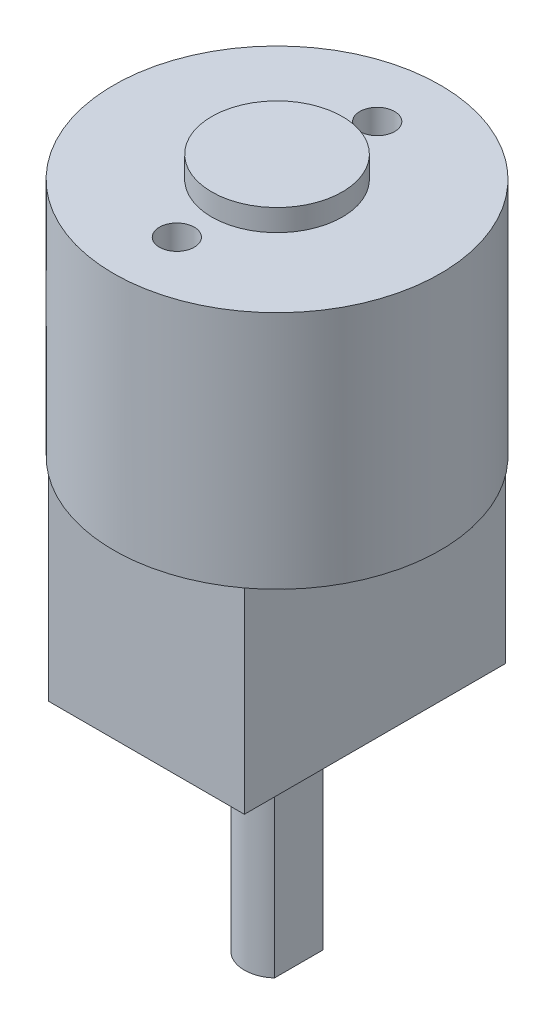
ISO-10303-21;
HEADER;
FILE_DESCRIPTION(('STEP AP214'),'2;1');
FILE_NAME('part.step','',(''),(''),'','','');
FILE_SCHEMA(('AUTOMOTIVE_DESIGN { 1 0 10303 214 1 1 1 1 }'));
ENDSEC;
DATA;
#1=APPLICATION_CONTEXT('core data for automotive mechanical design processes');
#2=APPLICATION_PROTOCOL_DEFINITION('international standard','automotive_design',2000,#1);
#3=PRODUCT_CONTEXT('',#1,'mechanical');
#4=PRODUCT('Part','Part','',(#3));
#5=PRODUCT_RELATED_PRODUCT_CATEGORY('part','',(#4));
#6=PRODUCT_DEFINITION_FORMATION('','',#4);
#7=PRODUCT_DEFINITION_CONTEXT('part definition',#1,'design');
#8=PRODUCT_DEFINITION('design','',#6,#7);
#9=PRODUCT_DEFINITION_SHAPE('','',#8);
#10=(LENGTH_UNIT() NAMED_UNIT(*) SI_UNIT(.MILLI.,.METRE.));
#11=(NAMED_UNIT(*) PLANE_ANGLE_UNIT() SI_UNIT($,.RADIAN.));
#12=(NAMED_UNIT(*) SI_UNIT($,.STERADIAN.) SOLID_ANGLE_UNIT());
#13=UNCERTAINTY_MEASURE_WITH_UNIT(LENGTH_MEASURE(1.E-05),#10,'distance_accuracy_value','');
#14=(GEOMETRIC_REPRESENTATION_CONTEXT(3) GLOBAL_UNCERTAINTY_ASSIGNED_CONTEXT((#13)) GLOBAL_UNIT_ASSIGNED_CONTEXT((#10,
#11,#12)) REPRESENTATION_CONTEXT('',''));
#15=CARTESIAN_POINT('',(0.,0.,0.));
#16=DIRECTION('',(0.,0.,1.));
#17=DIRECTION('',(1.,0.,0.));
#18=AXIS2_PLACEMENT_3D('',#15,#16,#17);
#19=CARTESIAN_POINT('',(0.,0.,0.));
#20=DIRECTION('',(0.,1.,0.));
#21=DIRECTION('',(0.,0.,1.));
#22=AXIS2_PLACEMENT_3D('',#19,#20,#21);
#23=PLANE('',#22);
#24=DIRECTION('',(0.,0.,-1.));
#25=VECTOR('',#24,1.);
#26=CARTESIAN_POINT('',(-4.5,0.,6.));
#27=LINE('',#26,#25);
#28=CARTESIAN_POINT('',(-4.5,0.,6.));
#29=VERTEX_POINT('',#28);
#30=CARTESIAN_POINT('',(-4.5,0.,-6.));
#31=VERTEX_POINT('',#30);
#32=EDGE_CURVE('E63',#29,#31,#27,.T.);
#33=ORIENTED_EDGE('',*,*,#32,.F.);
#34=CARTESIAN_POINT('',(0.,0.,0.));
#35=DIRECTION('',(0.,1.,0.));
#36=DIRECTION('',(0.,0.,1.));
#37=AXIS2_PLACEMENT_3D('',#34,#35,#36);
#38=CIRCLE('',#37,7.5);
#39=EDGE_CURVE('E168',#31,#29,#38,.T.);
#40=ORIENTED_EDGE('',*,*,#39,.F.);
#41=EDGE_LOOP('',(#33,#40));
#42=FACE_BOUND('',#41,.T.);
#43=ADVANCED_FACE('F39',(#42),#23,.F.);
#44=DIRECTION('',(-1.,0.,0.));
#45=VECTOR('',#44,1.);
#46=CARTESIAN_POINT('',(-4.5,0.,6.));
#47=LINE('',#46,#45);
#48=CARTESIAN_POINT('',(4.5,0.,6.));
#49=VERTEX_POINT('',#48);
#50=EDGE_CURVE('E128',#49,#29,#47,.T.);
#51=ORIENTED_EDGE('',*,*,#50,.F.);
#52=EDGE_CURVE('E156',#29,#49,#38,.T.);
#53=ORIENTED_EDGE('',*,*,#52,.F.);
#54=EDGE_LOOP('',(#51,#53));
#55=FACE_BOUND('',#54,.T.);
#56=ADVANCED_FACE('F200',(#55),#23,.F.);
#57=DIRECTION('',(0.,0.,1.));
#58=VECTOR('',#57,1.);
#59=CARTESIAN_POINT('',(4.5,0.,6.));
#60=LINE('',#59,#58);
#61=CARTESIAN_POINT('',(4.5,0.,-6.));
#62=VERTEX_POINT('',#61);
#63=EDGE_CURVE('E137',#62,#49,#60,.T.);
#64=ORIENTED_EDGE('',*,*,#63,.F.);
#65=EDGE_CURVE('E43',#49,#62,#38,.T.);
#66=ORIENTED_EDGE('',*,*,#65,.F.);
#67=EDGE_LOOP('',(#64,#66));
#68=FACE_BOUND('',#67,.T.);
#69=ADVANCED_FACE('F188',(#68),#23,.F.);
#70=DIRECTION('',(1.,0.,0.));
#71=VECTOR('',#70,1.);
#72=CARTESIAN_POINT('',(-4.5,0.,-6.));
#73=LINE('',#72,#71);
#74=EDGE_CURVE('E117',#31,#62,#73,.T.);
#75=ORIENTED_EDGE('',*,*,#74,.F.);
#76=EDGE_CURVE('E162',#62,#31,#38,.T.);
#77=ORIENTED_EDGE('',*,*,#76,.F.);
#78=EDGE_LOOP('',(#75,#77));
#79=FACE_BOUND('',#78,.T.);
#80=ADVANCED_FACE('F192',(#79),#23,.F.);
#81=CARTESIAN_POINT('',(0.,11.,0.));
#82=DIRECTION('',(0.,-1.,0.));
#83=DIRECTION('',(0.,0.,-1.));
#84=AXIS2_PLACEMENT_3D('',#81,#82,#83);
#85=CYLINDRICAL_SURFACE('',#84,7.5);
#86=CARTESIAN_POINT('',(0.,11.,0.));
#87=DIRECTION('',(0.,1.,0.));
#88=DIRECTION('',(0.,0.,1.));
#89=AXIS2_PLACEMENT_3D('',#86,#87,#88);
#90=CIRCLE('',#89,7.5);
#91=CARTESIAN_POINT('',(0.,11.,7.5));
#92=VERTEX_POINT('',#91);
#93=EDGE_CURVE('E158',#92,#92,#90,.T.);
#94=ORIENTED_EDGE('',*,*,#93,.F.);
#95=EDGE_LOOP('',(#94));
#96=FACE_BOUND('',#95,.T.);
#97=ORIENTED_EDGE('',*,*,#65,.T.);
#98=ORIENTED_EDGE('',*,*,#76,.T.);
#99=ORIENTED_EDGE('',*,*,#39,.T.);
#100=ORIENTED_EDGE('',*,*,#52,.T.);
#101=EDGE_LOOP('',(#97,#98,#99,#100));
#102=FACE_BOUND('',#101,.T.);
#103=ADVANCED_FACE('F41',(#96,#102),#85,.T.);
#104=CARTESIAN_POINT('',(0.,11.,0.));
#105=DIRECTION('',(0.,1.,0.));
#106=DIRECTION('',(0.,0.,1.));
#107=AXIS2_PLACEMENT_3D('',#104,#105,#106);
#108=PLANE('',#107);
#109=CARTESIAN_POINT('',(0.,11.,-4.6));
#110=DIRECTION('',(0.,1.,0.));
#111=DIRECTION('',(0.,0.,1.));
#112=AXIS2_PLACEMENT_3D('',#109,#110,#111);
#113=CIRCLE('',#112,0.8);
#114=CARTESIAN_POINT('',(0.,11.,-3.8));
#115=VERTEX_POINT('',#114);
#116=EDGE_CURVE('E530',#115,#115,#113,.T.);
#117=ORIENTED_EDGE('',*,*,#116,.F.);
#118=EDGE_LOOP('',(#117));
#119=FACE_BOUND('',#118,.T.);
#120=CARTESIAN_POINT('',(0.,11.,4.6));
#121=DIRECTION('',(0.,1.,0.));
#122=DIRECTION('',(0.,0.,1.));
#123=AXIS2_PLACEMENT_3D('',#120,#121,#122);
#124=CIRCLE('',#123,0.8);
#125=CARTESIAN_POINT('',(0.,11.,5.4));
#126=VERTEX_POINT('',#125);
#127=EDGE_CURVE('E536',#126,#126,#124,.T.);
#128=ORIENTED_EDGE('',*,*,#127,.F.);
#129=EDGE_LOOP('',(#128));
#130=FACE_BOUND('',#129,.T.);
#131=CARTESIAN_POINT('',(0.,11.,0.));
#132=DIRECTION('',(0.,1.,0.));
#133=DIRECTION('',(0.,0.,1.));
#134=AXIS2_PLACEMENT_3D('',#131,#132,#133);
#135=CIRCLE('',#134,3.);
#136=CARTESIAN_POINT('',(0.,11.,3.));
#137=VERTEX_POINT('',#136);
#138=EDGE_CURVE('E123',#137,#137,#135,.T.);
#139=ORIENTED_EDGE('',*,*,#138,.F.);
#140=EDGE_LOOP('',(#139));
#141=FACE_BOUND('',#140,.T.);
#142=ORIENTED_EDGE('',*,*,#93,.T.);
#143=EDGE_LOOP('',(#142));
#144=FACE_BOUND('',#143,.T.);
#145=ADVANCED_FACE('F198',(#119,#130,#141,#144),#108,.T.);
#146=CARTESIAN_POINT('',(0.,12.,0.));
#147=DIRECTION('',(0.,-1.,0.));
#148=DIRECTION('',(0.,0.,-1.));
#149=AXIS2_PLACEMENT_3D('',#146,#147,#148);
#150=CYLINDRICAL_SURFACE('',#149,3.);
#151=CARTESIAN_POINT('',(0.,12.,0.));
#152=DIRECTION('',(0.,1.,0.));
#153=DIRECTION('',(0.,0.,1.));
#154=AXIS2_PLACEMENT_3D('',#151,#152,#153);
#155=CIRCLE('',#154,3.);
#156=CARTESIAN_POINT('',(0.,12.,3.));
#157=VERTEX_POINT('',#156);
#158=EDGE_CURVE('E153',#157,#157,#155,.T.);
#159=ORIENTED_EDGE('',*,*,#158,.F.);
#160=EDGE_LOOP('',(#159));
#161=FACE_BOUND('',#160,.T.);
#162=ORIENTED_EDGE('',*,*,#138,.T.);
#163=EDGE_LOOP('',(#162));
#164=FACE_BOUND('',#163,.T.);
#165=ADVANCED_FACE('F233',(#161,#164),#150,.T.);
#166=CARTESIAN_POINT('',(0.,12.,0.));
#167=DIRECTION('',(0.,1.,0.));
#168=DIRECTION('',(0.,0.,1.));
#169=AXIS2_PLACEMENT_3D('',#166,#167,#168);
#170=PLANE('',#169);
#171=ORIENTED_EDGE('',*,*,#158,.T.);
#172=EDGE_LOOP('',(#171));
#173=FACE_BOUND('',#172,.T.);
#174=ADVANCED_FACE('F244',(#173),#170,.T.);
#175=CARTESIAN_POINT('',(-4.5,-9.,6.));
#176=DIRECTION('',(1.,0.,0.));
#177=DIRECTION('',(0.,0.,-1.));
#178=AXIS2_PLACEMENT_3D('',#175,#176,#177);
#179=PLANE('',#178);
#180=ORIENTED_EDGE('',*,*,#32,.T.);
#181=DIRECTION('',(0.,1.,0.));
#182=VECTOR('',#181,1.);
#183=CARTESIAN_POINT('',(-4.5,-9.,-6.));
#184=LINE('',#183,#182);
#185=CARTESIAN_POINT('',(-4.5,-9.,-6.));
#186=VERTEX_POINT('',#185);
#187=EDGE_CURVE('E150',#186,#31,#184,.T.);
#188=ORIENTED_EDGE('',*,*,#187,.F.);
#189=DIRECTION('',(0.,0.,-1.));
#190=VECTOR('',#189,1.);
#191=CARTESIAN_POINT('',(-4.5,-9.,6.));
#192=LINE('',#191,#190);
#193=CARTESIAN_POINT('',(-4.5,-9.,6.));
#194=VERTEX_POINT('',#193);
#195=EDGE_CURVE('E124',#194,#186,#192,.T.);
#196=ORIENTED_EDGE('',*,*,#195,.F.);
#197=DIRECTION('',(0.,1.,0.));
#198=VECTOR('',#197,1.);
#199=CARTESIAN_POINT('',(-4.5,-9.,6.));
#200=LINE('',#199,#198);
#201=EDGE_CURVE('E133',#194,#29,#200,.T.);
#202=ORIENTED_EDGE('',*,*,#201,.T.);
#203=EDGE_LOOP('',(#180,#188,#196,#202));
#204=FACE_BOUND('',#203,.T.);
#205=ADVANCED_FACE('F178',(#204),#179,.F.);
#206=CARTESIAN_POINT('',(-4.5,-9.,-6.));
#207=DIRECTION('',(0.,0.,1.));
#208=DIRECTION('',(1.,0.,0.));
#209=AXIS2_PLACEMENT_3D('',#206,#207,#208);
#210=PLANE('',#209);
#211=ORIENTED_EDGE('',*,*,#74,.T.);
#212=DIRECTION('',(0.,1.,0.));
#213=VECTOR('',#212,1.);
#214=CARTESIAN_POINT('',(4.5,-9.,-6.));
#215=LINE('',#214,#213);
#216=CARTESIAN_POINT('',(4.5,-9.,-6.));
#217=VERTEX_POINT('',#216);
#218=EDGE_CURVE('E147',#217,#62,#215,.T.);
#219=ORIENTED_EDGE('',*,*,#218,.F.);
#220=DIRECTION('',(1.,0.,0.));
#221=VECTOR('',#220,1.);
#222=CARTESIAN_POINT('',(-4.5,-9.,-6.));
#223=LINE('',#222,#221);
#224=EDGE_CURVE('E127',#186,#217,#223,.T.);
#225=ORIENTED_EDGE('',*,*,#224,.F.);
#226=ORIENTED_EDGE('',*,*,#187,.T.);
#227=EDGE_LOOP('',(#211,#219,#225,#226));
#228=FACE_BOUND('',#227,.T.);
#229=ADVANCED_FACE('F190',(#228),#210,.F.);
#230=CARTESIAN_POINT('',(4.5,-9.,6.));
#231=DIRECTION('',(-1.,0.,0.));
#232=DIRECTION('',(0.,0.,1.));
#233=AXIS2_PLACEMENT_3D('',#230,#231,#232);
#234=PLANE('',#233);
#235=ORIENTED_EDGE('',*,*,#63,.T.);
#236=DIRECTION('',(0.,1.,0.));
#237=VECTOR('',#236,1.);
#238=CARTESIAN_POINT('',(4.5,-9.,6.));
#239=LINE('',#238,#237);
#240=CARTESIAN_POINT('',(4.5,-9.,6.));
#241=VERTEX_POINT('',#240);
#242=EDGE_CURVE('E144',#241,#49,#239,.T.);
#243=ORIENTED_EDGE('',*,*,#242,.F.);
#244=DIRECTION('',(0.,0.,1.));
#245=VECTOR('',#244,1.);
#246=CARTESIAN_POINT('',(4.5,-9.,6.));
#247=LINE('',#246,#245);
#248=EDGE_CURVE('E130',#217,#241,#247,.T.);
#249=ORIENTED_EDGE('',*,*,#248,.F.);
#250=ORIENTED_EDGE('',*,*,#218,.T.);
#251=EDGE_LOOP('',(#235,#243,#249,#250));
#252=FACE_BOUND('',#251,.T.);
#253=ADVANCED_FACE('F185',(#252),#234,.F.);
#254=CARTESIAN_POINT('',(-4.5,-9.,6.));
#255=DIRECTION('',(0.,0.,-1.));
#256=DIRECTION('',(-1.,0.,0.));
#257=AXIS2_PLACEMENT_3D('',#254,#255,#256);
#258=PLANE('',#257);
#259=ORIENTED_EDGE('',*,*,#50,.T.);
#260=ORIENTED_EDGE('',*,*,#201,.F.);
#261=DIRECTION('',(-1.,0.,0.));
#262=VECTOR('',#261,1.);
#263=CARTESIAN_POINT('',(-4.5,-9.,6.));
#264=LINE('',#263,#262);
#265=EDGE_CURVE('E132',#241,#194,#264,.T.);
#266=ORIENTED_EDGE('',*,*,#265,.F.);
#267=ORIENTED_EDGE('',*,*,#242,.T.);
#268=EDGE_LOOP('',(#259,#260,#266,#267));
#269=FACE_BOUND('',#268,.T.);
#270=ADVANCED_FACE('F172',(#269),#258,.F.);
#271=CARTESIAN_POINT('',(0.,-9.,0.));
#272=DIRECTION('',(0.,-1.,0.));
#273=DIRECTION('',(0.,0.,-1.));
#274=AXIS2_PLACEMENT_3D('',#271,#272,#273);
#275=PLANE('',#274);
#276=CARTESIAN_POINT('',(0.,-9.,4.5));
#277=DIRECTION('',(0.,-1.,0.));
#278=DIRECTION('',(0.,0.,-1.));
#279=AXIS2_PLACEMENT_3D('',#276,#277,#278);
#280=CIRCLE('',#279,0.8);
#281=CARTESIAN_POINT('',(0.,-9.,3.7));
#282=VERTEX_POINT('',#281);
#283=EDGE_CURVE('E547',#282,#282,#280,.T.);
#284=ORIENTED_EDGE('',*,*,#283,.F.);
#285=EDGE_LOOP('',(#284));
#286=FACE_BOUND('',#285,.T.);
#287=CARTESIAN_POINT('',(0.,-9.,-4.5));
#288=DIRECTION('',(0.,-1.,0.));
#289=DIRECTION('',(0.,0.,-1.));
#290=AXIS2_PLACEMENT_3D('',#287,#288,#289);
#291=CIRCLE('',#290,0.8);
#292=CARTESIAN_POINT('',(0.,-9.,-5.3));
#293=VERTEX_POINT('',#292);
#294=EDGE_CURVE('E533',#293,#293,#291,.T.);
#295=ORIENTED_EDGE('',*,*,#294,.F.);
#296=EDGE_LOOP('',(#295));
#297=FACE_BOUND('',#296,.T.);
#298=CARTESIAN_POINT('',(0.,-9.,0.));
#299=DIRECTION('',(0.,-1.,0.));
#300=DIRECTION('',(0.,0.,-1.));
#301=AXIS2_PLACEMENT_3D('',#298,#299,#300);
#302=CIRCLE('',#301,2.);
#303=CARTESIAN_POINT('',(0.,-9.,-2.));
#304=VERTEX_POINT('',#303);
#305=EDGE_CURVE('E48',#304,#304,#302,.T.);
#306=ORIENTED_EDGE('',*,*,#305,.F.);
#307=EDGE_LOOP('',(#306));
#308=FACE_BOUND('',#307,.T.);
#309=ORIENTED_EDGE('',*,*,#195,.T.);
#310=ORIENTED_EDGE('',*,*,#224,.T.);
#311=ORIENTED_EDGE('',*,*,#248,.T.);
#312=ORIENTED_EDGE('',*,*,#265,.T.);
#313=EDGE_LOOP('',(#309,#310,#311,#312));
#314=FACE_BOUND('',#313,.T.);
#315=ADVANCED_FACE('F181',(#286,#297,#308,#314),#275,.T.);
#316=CARTESIAN_POINT('',(0.,-9.7,0.));
#317=DIRECTION('',(0.,1.,0.));
#318=DIRECTION('',(0.,0.,1.));
#319=AXIS2_PLACEMENT_3D('',#316,#317,#318);
#320=CYLINDRICAL_SURFACE('',#319,2.);
#321=CARTESIAN_POINT('',(0.,-9.7,0.));
#322=DIRECTION('',(0.,-1.,0.));
#323=DIRECTION('',(0.,0.,-1.));
#324=AXIS2_PLACEMENT_3D('',#321,#322,#323);
#325=CIRCLE('',#324,2.);
#326=CARTESIAN_POINT('',(0.,-9.7,-2.));
#327=VERTEX_POINT('',#326);
#328=EDGE_CURVE('E114',#327,#327,#325,.T.);
#329=ORIENTED_EDGE('',*,*,#328,.F.);
#330=EDGE_LOOP('',(#329));
#331=FACE_BOUND('',#330,.T.);
#332=ORIENTED_EDGE('',*,*,#305,.T.);
#333=EDGE_LOOP('',(#332));
#334=FACE_BOUND('',#333,.T.);
#335=ADVANCED_FACE('F110',(#331,#334),#320,.T.);
#336=CARTESIAN_POINT('',(0.,-9.7,0.));
#337=DIRECTION('',(0.,-1.,0.));
#338=DIRECTION('',(0.,0.,-1.));
#339=AXIS2_PLACEMENT_3D('',#336,#337,#338);
#340=PLANE('',#339);
#341=CARTESIAN_POINT('',(0.,-9.7,0.));
#342=DIRECTION('',(0.,-1.,0.));
#343=DIRECTION('',(0.,0.,-1.));
#344=AXIS2_PLACEMENT_3D('',#341,#342,#343);
#345=CIRCLE('',#344,1.5);
#346=CARTESIAN_POINT('',(1.,-9.7,1.1180339887499));
#347=VERTEX_POINT('',#346);
#348=CARTESIAN_POINT('',(1.,-9.7,-1.1180339887499));
#349=VERTEX_POINT('',#348);
#350=EDGE_CURVE('E11',#347,#349,#345,.T.);
#351=ORIENTED_EDGE('',*,*,#350,.F.);
#352=DIRECTION('',(0.,0.,-1.));
#353=VECTOR('',#352,1.);
#354=CARTESIAN_POINT('',(1.,-9.7,0.));
#355=LINE('',#354,#353);
#356=EDGE_CURVE('E93',#347,#349,#355,.T.);
#357=ORIENTED_EDGE('',*,*,#356,.T.);
#358=EDGE_LOOP('',(#351,#357));
#359=FACE_BOUND('',#358,.T.);
#360=ORIENTED_EDGE('',*,*,#328,.T.);
#361=EDGE_LOOP('',(#360));
#362=FACE_BOUND('',#361,.T.);
#363=ADVANCED_FACE('F107',(#359,#362),#340,.T.);
#364=CARTESIAN_POINT('',(0.,-19.7,0.));
#365=DIRECTION('',(0.,1.,0.));
#366=DIRECTION('',(0.,0.,1.));
#367=AXIS2_PLACEMENT_3D('',#364,#365,#366);
#368=CYLINDRICAL_SURFACE('',#367,1.5);
#369=CARTESIAN_POINT('',(0.,-19.7,0.));
#370=DIRECTION('',(0.,-1.,0.));
#371=DIRECTION('',(0.,0.,-1.));
#372=AXIS2_PLACEMENT_3D('',#369,#370,#371);
#373=CIRCLE('',#372,1.5);
#374=CARTESIAN_POINT('',(1.,-19.7,1.1180339887499));
#375=VERTEX_POINT('',#374);
#376=CARTESIAN_POINT('',(1.,-19.7,-1.1180339887499));
#377=VERTEX_POINT('',#376);
#378=EDGE_CURVE('E105',#375,#377,#373,.T.);
#379=ORIENTED_EDGE('',*,*,#378,.F.);
#380=DIRECTION('',(0.,-1.,0.));
#381=VECTOR('',#380,1.);
#382=CARTESIAN_POINT('',(1.,-9.7,1.1180339887499));
#383=LINE('',#382,#381);
#384=EDGE_CURVE('E56',#347,#375,#383,.T.);
#385=ORIENTED_EDGE('',*,*,#384,.F.);
#386=ORIENTED_EDGE('',*,*,#350,.T.);
#387=DIRECTION('',(0.,-1.,0.));
#388=VECTOR('',#387,1.);
#389=CARTESIAN_POINT('',(1.,-9.7,-1.1180339887499));
#390=LINE('',#389,#388);
#391=EDGE_CURVE('E96',#349,#377,#390,.T.);
#392=ORIENTED_EDGE('',*,*,#391,.T.);
#393=EDGE_LOOP('',(#379,#385,#386,#392));
#394=FACE_BOUND('',#393,.T.);
#395=ADVANCED_FACE('F103',(#394),#368,.T.);
#396=CARTESIAN_POINT('',(0.,-19.7,0.));
#397=DIRECTION('',(0.,-1.,0.));
#398=DIRECTION('',(0.,0.,-1.));
#399=AXIS2_PLACEMENT_3D('',#396,#397,#398);
#400=PLANE('',#399);
#401=DIRECTION('',(0.,0.,-1.));
#402=VECTOR('',#401,1.);
#403=CARTESIAN_POINT('',(1.,-19.7,0.));
#404=LINE('',#403,#402);
#405=EDGE_CURVE('E99',#375,#377,#404,.T.);
#406=ORIENTED_EDGE('',*,*,#405,.F.);
#407=ORIENTED_EDGE('',*,*,#378,.T.);
#408=EDGE_LOOP('',(#406,#407));
#409=FACE_BOUND('',#408,.T.);
#410=ADVANCED_FACE('F319',(#409),#400,.T.);
#411=CARTESIAN_POINT('',(1.,-9.7,0.));
#412=DIRECTION('',(-1.,0.,0.));
#413=DIRECTION('',(0.,0.,1.));
#414=AXIS2_PLACEMENT_3D('',#411,#412,#413);
#415=PLANE('',#414);
#416=ORIENTED_EDGE('',*,*,#405,.T.);
#417=ORIENTED_EDGE('',*,*,#391,.F.);
#418=ORIENTED_EDGE('',*,*,#356,.F.);
#419=ORIENTED_EDGE('',*,*,#384,.T.);
#420=EDGE_LOOP('',(#416,#417,#418,#419));
#421=FACE_BOUND('',#420,.T.);
#422=ADVANCED_FACE('F94',(#421),#415,.F.);
#423=CARTESIAN_POINT('',(0.,-4.,-4.5));
#424=DIRECTION('',(0.,-1.,0.));
#425=DIRECTION('',(0.,0.,-1.));
#426=AXIS2_PLACEMENT_3D('',#423,#424,#425);
#427=CYLINDRICAL_SURFACE('',#426,0.8);
#428=CARTESIAN_POINT('',(0.,-4.,-4.5));
#429=DIRECTION('',(0.,-1.,0.));
#430=DIRECTION('',(0.,0.,-1.));
#431=AXIS2_PLACEMENT_3D('',#428,#429,#430);
#432=CIRCLE('',#431,0.8);
#433=CARTESIAN_POINT('',(0.,-4.,-5.3));
#434=VERTEX_POINT('',#433);
#435=EDGE_CURVE('E529',#434,#434,#432,.T.);
#436=ORIENTED_EDGE('',*,*,#435,.F.);
#437=EDGE_LOOP('',(#436));
#438=FACE_BOUND('',#437,.T.);
#439=ORIENTED_EDGE('',*,*,#294,.T.);
#440=EDGE_LOOP('',(#439));
#441=FACE_BOUND('',#440,.T.);
#442=ADVANCED_FACE('F337',(#438,#441),#427,.F.);
#443=CARTESIAN_POINT('',(0.,-4.,-4.5));
#444=DIRECTION('',(0.,-1.,0.));
#445=DIRECTION('',(0.,0.,-1.));
#446=AXIS2_PLACEMENT_3D('',#443,#444,#445);
#447=PLANE('',#446);
#448=ORIENTED_EDGE('',*,*,#435,.T.);
#449=EDGE_LOOP('',(#448));
#450=FACE_BOUND('',#449,.T.);
#451=ADVANCED_FACE('F346',(#450),#447,.T.);
#452=CARTESIAN_POINT('',(0.,-4.,4.5));
#453=DIRECTION('',(0.,-1.,0.));
#454=DIRECTION('',(0.,0.,-1.));
#455=AXIS2_PLACEMENT_3D('',#452,#453,#454);
#456=CYLINDRICAL_SURFACE('',#455,0.8);
#457=CARTESIAN_POINT('',(0.,-4.,4.5));
#458=DIRECTION('',(0.,-1.,0.));
#459=DIRECTION('',(0.,0.,-1.));
#460=AXIS2_PLACEMENT_3D('',#457,#458,#459);
#461=CIRCLE('',#460,0.8);
#462=CARTESIAN_POINT('',(0.,-4.,3.7));
#463=VERTEX_POINT('',#462);
#464=EDGE_CURVE('E544',#463,#463,#461,.T.);
#465=ORIENTED_EDGE('',*,*,#464,.F.);
#466=EDGE_LOOP('',(#465));
#467=FACE_BOUND('',#466,.T.);
#468=ORIENTED_EDGE('',*,*,#283,.T.);
#469=EDGE_LOOP('',(#468));
#470=FACE_BOUND('',#469,.T.);
#471=ADVANCED_FACE('F356',(#467,#470),#456,.F.);
#472=CARTESIAN_POINT('',(0.,-4.,4.5));
#473=DIRECTION('',(0.,-1.,0.));
#474=DIRECTION('',(0.,0.,-1.));
#475=AXIS2_PLACEMENT_3D('',#472,#473,#474);
#476=PLANE('',#475);
#477=ORIENTED_EDGE('',*,*,#464,.T.);
#478=EDGE_LOOP('',(#477));
#479=FACE_BOUND('',#478,.T.);
#480=ADVANCED_FACE('F366',(#479),#476,.T.);
#481=CARTESIAN_POINT('',(0.,6.,4.6));
#482=DIRECTION('',(0.,1.,0.));
#483=DIRECTION('',(0.,0.,1.));
#484=AXIS2_PLACEMENT_3D('',#481,#482,#483);
#485=CYLINDRICAL_SURFACE('',#484,0.8);
#486=CARTESIAN_POINT('',(0.,6.,4.6));
#487=DIRECTION('',(0.,1.,0.));
#488=DIRECTION('',(0.,0.,1.));
#489=AXIS2_PLACEMENT_3D('',#486,#487,#488);
#490=CIRCLE('',#489,0.8);
#491=CARTESIAN_POINT('',(0.,6.,5.4));
#492=VERTEX_POINT('',#491);
#493=EDGE_CURVE('E541',#492,#492,#490,.T.);
#494=ORIENTED_EDGE('',*,*,#493,.F.);
#495=EDGE_LOOP('',(#494));
#496=FACE_BOUND('',#495,.T.);
#497=ORIENTED_EDGE('',*,*,#127,.T.);
#498=EDGE_LOOP('',(#497));
#499=FACE_BOUND('',#498,.T.);
#500=ADVANCED_FACE('F376',(#496,#499),#485,.F.);
#501=CARTESIAN_POINT('',(0.,6.,4.6));
#502=DIRECTION('',(0.,1.,0.));
#503=DIRECTION('',(0.,0.,1.));
#504=AXIS2_PLACEMENT_3D('',#501,#502,#503);
#505=PLANE('',#504);
#506=ORIENTED_EDGE('',*,*,#493,.T.);
#507=EDGE_LOOP('',(#506));
#508=FACE_BOUND('',#507,.T.);
#509=ADVANCED_FACE('F386',(#508),#505,.T.);
#510=CARTESIAN_POINT('',(0.,6.,-4.6));
#511=DIRECTION('',(0.,1.,0.));
#512=DIRECTION('',(0.,0.,1.));
#513=AXIS2_PLACEMENT_3D('',#510,#511,#512);
#514=CYLINDRICAL_SURFACE('',#513,0.8);
#515=CARTESIAN_POINT('',(0.,6.,-4.6));
#516=DIRECTION('',(0.,1.,0.));
#517=DIRECTION('',(0.,0.,1.));
#518=AXIS2_PLACEMENT_3D('',#515,#516,#517);
#519=CIRCLE('',#518,0.8);
#520=CARTESIAN_POINT('',(0.,6.,-3.8));
#521=VERTEX_POINT('',#520);
#522=EDGE_CURVE('E528',#521,#521,#519,.T.);
#523=ORIENTED_EDGE('',*,*,#522,.F.);
#524=EDGE_LOOP('',(#523));
#525=FACE_BOUND('',#524,.T.);
#526=ORIENTED_EDGE('',*,*,#116,.T.);
#527=EDGE_LOOP('',(#526));
#528=FACE_BOUND('',#527,.T.);
#529=ADVANCED_FACE('F396',(#525,#528),#514,.F.);
#530=CARTESIAN_POINT('',(0.,6.,-4.6));
#531=DIRECTION('',(0.,1.,0.));
#532=DIRECTION('',(0.,0.,1.));
#533=AXIS2_PLACEMENT_3D('',#530,#531,#532);
#534=PLANE('',#533);
#535=ORIENTED_EDGE('',*,*,#522,.T.);
#536=EDGE_LOOP('',(#535));
#537=FACE_BOUND('',#536,.T.);
#538=ADVANCED_FACE('F406',(#537),#534,.T.);
#539=CLOSED_SHELL('',(#43,#56,#69,#80,#103,#145,#165,#174,#205,#229,#253,#270,#315,#335,#363,
#395,#410,#422,#442,#451,#471,#480,#500,#509,#529,#538));
#540=MANIFOLD_SOLID_BREP('B2',#539);
#541=ADVANCED_BREP_SHAPE_REPRESENTATION('',(#18,#540),#14);
#542=SHAPE_DEFINITION_REPRESENTATION(#9,#541);
ENDSEC;
END-ISO-10303-21;
